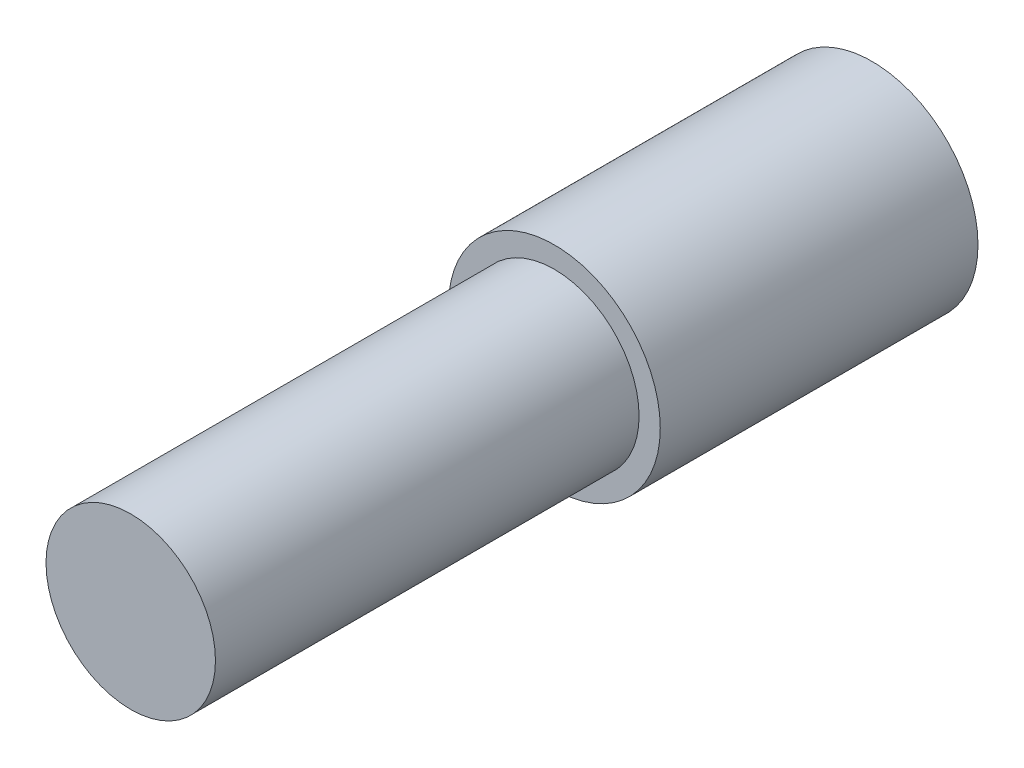
ISO-10303-21;
HEADER;
FILE_DESCRIPTION(('STEP AP214'),'2;1');
FILE_NAME('part.step','',(''),(''),'','','');
FILE_SCHEMA(('AUTOMOTIVE_DESIGN { 1 0 10303 214 1 1 1 1 }'));
ENDSEC;
DATA;
#1=APPLICATION_CONTEXT('core data for automotive mechanical design processes');
#2=APPLICATION_PROTOCOL_DEFINITION('international standard','automotive_design',2000,#1);
#3=PRODUCT_CONTEXT('',#1,'mechanical');
#4=PRODUCT('Part','Part','',(#3));
#5=PRODUCT_RELATED_PRODUCT_CATEGORY('part','',(#4));
#6=PRODUCT_DEFINITION_FORMATION('','',#4);
#7=PRODUCT_DEFINITION_CONTEXT('part definition',#1,'design');
#8=PRODUCT_DEFINITION('design','',#6,#7);
#9=PRODUCT_DEFINITION_SHAPE('','',#8);
#10=(LENGTH_UNIT() NAMED_UNIT(*) SI_UNIT(.MILLI.,.METRE.));
#11=(NAMED_UNIT(*) PLANE_ANGLE_UNIT() SI_UNIT($,.RADIAN.));
#12=(NAMED_UNIT(*) SI_UNIT($,.STERADIAN.) SOLID_ANGLE_UNIT());
#13=UNCERTAINTY_MEASURE_WITH_UNIT(LENGTH_MEASURE(1.E-05),#10,'distance_accuracy_value','');
#14=(GEOMETRIC_REPRESENTATION_CONTEXT(3) GLOBAL_UNCERTAINTY_ASSIGNED_CONTEXT((#13)) GLOBAL_UNIT_ASSIGNED_CONTEXT((#10,
#11,#12)) REPRESENTATION_CONTEXT('',''));
#15=CARTESIAN_POINT('',(0.,0.,0.));
#16=DIRECTION('',(0.,0.,1.));
#17=DIRECTION('',(1.,0.,0.));
#18=AXIS2_PLACEMENT_3D('',#15,#16,#17);
#19=CARTESIAN_POINT('',(0.,0.,15.));
#20=DIRECTION('',(0.,0.,-1.));
#21=DIRECTION('',(-1.,0.,0.));
#22=AXIS2_PLACEMENT_3D('',#19,#20,#21);
#23=CYLINDRICAL_SURFACE('',#22,5.);
#24=CARTESIAN_POINT('',(0.,0.,15.));
#25=DIRECTION('',(0.,0.,1.));
#26=DIRECTION('',(1.,0.,0.));
#27=AXIS2_PLACEMENT_3D('',#24,#25,#26);
#28=CIRCLE('',#27,5.);
#29=CARTESIAN_POINT('',(5.,0.,15.));
#30=VERTEX_POINT('',#29);
#31=EDGE_CURVE('E10',#30,#30,#28,.T.);
#32=ORIENTED_EDGE('',*,*,#31,.F.);
#33=EDGE_LOOP('',(#32));
#34=FACE_BOUND('',#33,.T.);
#35=CARTESIAN_POINT('',(0.,0.,0.));
#36=DIRECTION('',(0.,0.,1.));
#37=DIRECTION('',(1.,0.,0.));
#38=AXIS2_PLACEMENT_3D('',#35,#36,#37);
#39=CIRCLE('',#38,5.);
#40=CARTESIAN_POINT('',(5.,0.,0.));
#41=VERTEX_POINT('',#40);
#42=EDGE_CURVE('E34',#41,#41,#39,.T.);
#43=ORIENTED_EDGE('',*,*,#42,.T.);
#44=EDGE_LOOP('',(#43));
#45=FACE_BOUND('',#44,.T.);
#46=ADVANCED_FACE('F31',(#34,#45),#23,.T.);
#47=CARTESIAN_POINT('',(0.,0.,15.));
#48=DIRECTION('',(0.,0.,1.));
#49=DIRECTION('',(1.,0.,0.));
#50=AXIS2_PLACEMENT_3D('',#47,#48,#49);
#51=PLANE('',#50);
#52=CARTESIAN_POINT('',(0.,0.,15.));
#53=DIRECTION('',(0.,0.,1.));
#54=DIRECTION('',(1.,0.,0.));
#55=AXIS2_PLACEMENT_3D('',#52,#53,#54);
#56=CIRCLE('',#55,4.);
#57=CARTESIAN_POINT('',(4.,0.,15.));
#58=VERTEX_POINT('',#57);
#59=EDGE_CURVE('E43',#58,#58,#56,.T.);
#60=ORIENTED_EDGE('',*,*,#59,.F.);
#61=EDGE_LOOP('',(#60));
#62=FACE_BOUND('',#61,.T.);
#63=ORIENTED_EDGE('',*,*,#31,.T.);
#64=EDGE_LOOP('',(#63));
#65=FACE_BOUND('',#64,.T.);
#66=ADVANCED_FACE('F58',(#62,#65),#51,.T.);
#67=CARTESIAN_POINT('',(0.,0.,0.));
#68=DIRECTION('',(0.,0.,1.));
#69=DIRECTION('',(1.,0.,0.));
#70=AXIS2_PLACEMENT_3D('',#67,#68,#69);
#71=PLANE('',#70);
#72=ORIENTED_EDGE('',*,*,#42,.F.);
#73=EDGE_LOOP('',(#72));
#74=FACE_BOUND('',#73,.T.);
#75=ADVANCED_FACE('F54',(#74),#71,.F.);
#76=CARTESIAN_POINT('',(0.,0.,35.));
#77=DIRECTION('',(0.,0.,-1.));
#78=DIRECTION('',(-1.,0.,0.));
#79=AXIS2_PLACEMENT_3D('',#76,#77,#78);
#80=CYLINDRICAL_SURFACE('',#79,4.);
#81=CARTESIAN_POINT('',(0.,0.,35.));
#82=DIRECTION('',(0.,0.,1.));
#83=DIRECTION('',(1.,0.,0.));
#84=AXIS2_PLACEMENT_3D('',#81,#82,#83);
#85=CIRCLE('',#84,4.);
#86=CARTESIAN_POINT('',(4.,0.,35.));
#87=VERTEX_POINT('',#86);
#88=EDGE_CURVE('E41',#87,#87,#85,.T.);
#89=ORIENTED_EDGE('',*,*,#88,.F.);
#90=EDGE_LOOP('',(#89));
#91=FACE_BOUND('',#90,.T.);
#92=ORIENTED_EDGE('',*,*,#59,.T.);
#93=EDGE_LOOP('',(#92));
#94=FACE_BOUND('',#93,.T.);
#95=ADVANCED_FACE('F51',(#91,#94),#80,.T.);
#96=CARTESIAN_POINT('',(0.,0.,35.));
#97=DIRECTION('',(0.,0.,1.));
#98=DIRECTION('',(1.,0.,0.));
#99=AXIS2_PLACEMENT_3D('',#96,#97,#98);
#100=PLANE('',#99);
#101=ORIENTED_EDGE('',*,*,#88,.T.);
#102=EDGE_LOOP('',(#101));
#103=FACE_BOUND('',#102,.T.);
#104=ADVANCED_FACE('F49',(#103),#100,.T.);
#105=CLOSED_SHELL('',(#46,#66,#75,#95,#104));
#106=MANIFOLD_SOLID_BREP('B2',#105);
#107=ADVANCED_BREP_SHAPE_REPRESENTATION('',(#18,#106),#14);
#108=SHAPE_DEFINITION_REPRESENTATION(#9,#107);
ENDSEC;
END-ISO-10303-21;
